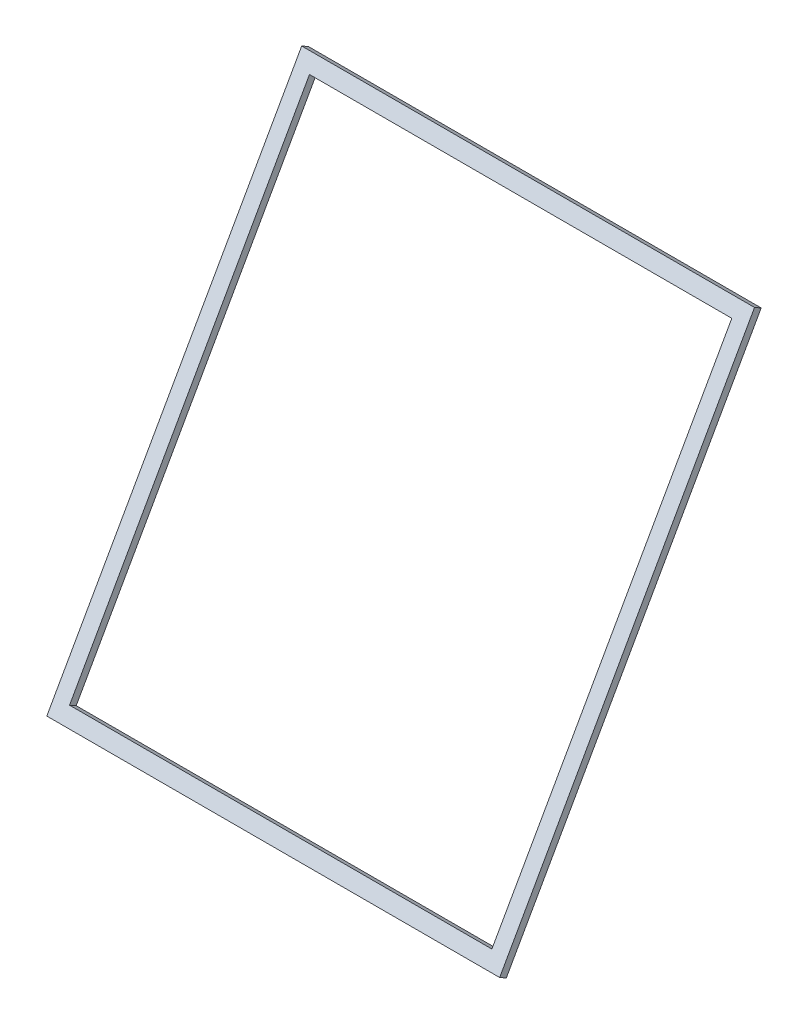
ISO-10303-21;
HEADER;
FILE_DESCRIPTION(('STEP AP214'),'2;1');
FILE_NAME('part.step','',(''),(''),'','','');
FILE_SCHEMA(('AUTOMOTIVE_DESIGN { 1 0 10303 214 1 1 1 1 }'));
ENDSEC;
DATA;
#1=APPLICATION_CONTEXT('core data for automotive mechanical design processes');
#2=APPLICATION_PROTOCOL_DEFINITION('international standard','automotive_design',2000,#1);
#3=PRODUCT_CONTEXT('',#1,'mechanical');
#4=PRODUCT('Part','Part','',(#3));
#5=PRODUCT_RELATED_PRODUCT_CATEGORY('part','',(#4));
#6=PRODUCT_DEFINITION_FORMATION('','',#4);
#7=PRODUCT_DEFINITION_CONTEXT('part definition',#1,'design');
#8=PRODUCT_DEFINITION('design','',#6,#7);
#9=PRODUCT_DEFINITION_SHAPE('','',#8);
#10=(LENGTH_UNIT() NAMED_UNIT(*) SI_UNIT(.MILLI.,.METRE.));
#11=(NAMED_UNIT(*) PLANE_ANGLE_UNIT() SI_UNIT($,.RADIAN.));
#12=(NAMED_UNIT(*) SI_UNIT($,.STERADIAN.) SOLID_ANGLE_UNIT());
#13=UNCERTAINTY_MEASURE_WITH_UNIT(LENGTH_MEASURE(1.E-05),#10,'distance_accuracy_value','');
#14=(GEOMETRIC_REPRESENTATION_CONTEXT(3) GLOBAL_UNCERTAINTY_ASSIGNED_CONTEXT((#13)) GLOBAL_UNIT_ASSIGNED_CONTEXT((#10,
#11,#12)) REPRESENTATION_CONTEXT('',''));
#15=CARTESIAN_POINT('',(0.,0.,0.));
#16=DIRECTION('',(0.,0.,1.));
#17=DIRECTION('',(1.,0.,0.));
#18=AXIS2_PLACEMENT_3D('',#15,#16,#17);
#19=CARTESIAN_POINT('',(-156.14773579459,170.242583244298,-2.17498509552936));
#20=DIRECTION('',(-1.,0.,0.));
#21=DIRECTION('',(0.,0.,1.));
#22=AXIS2_PLACEMENT_3D('',#19,#20,#21);
#23=PLANE('',#22);
#24=DIRECTION('',(0.,0.87144251679812,-0.490497645169228));
#25=VECTOR('',#24,1.);
#26=CARTESIAN_POINT('',(-156.14773579459,167.790095018452,-6.53219767951996));
#27=LINE('',#26,#25);
#28=CARTESIAN_POINT('',(-156.14773579459,-128.9971906038,160.516645942148));
#29=VERTEX_POINT('',#28);
#30=CARTESIAN_POINT('',(-156.14773579459,167.790095018452,-6.53219767951996));
#31=VERTEX_POINT('',#30);
#32=EDGE_CURVE('E131',#29,#31,#27,.T.);
#33=ORIENTED_EDGE('',*,*,#32,.F.);
#34=DIRECTION('',(0.,-0.490497645169228,-0.87144251679812));
#35=VECTOR('',#34,1.);
#36=CARTESIAN_POINT('',(-156.14773579459,-126.544702377954,164.873858526138));
#37=LINE('',#36,#35);
#38=CARTESIAN_POINT('',(-156.14773579459,-126.544702377954,164.873858526138));
#39=VERTEX_POINT('',#38);
#40=EDGE_CURVE('E11',#39,#29,#37,.T.);
#41=ORIENTED_EDGE('',*,*,#40,.F.);
#42=DIRECTION('',(0.,0.87144251679812,-0.490497645169228));
#43=VECTOR('',#42,1.);
#44=CARTESIAN_POINT('',(-156.14773579459,170.242583244298,-2.17498509552936));
#45=LINE('',#44,#43);
#46=CARTESIAN_POINT('',(-156.14773579459,170.242583244298,-2.17498509552936));
#47=VERTEX_POINT('',#46);
#48=EDGE_CURVE('E135',#39,#47,#45,.T.);
#49=ORIENTED_EDGE('',*,*,#48,.T.);
#50=DIRECTION('',(0.,-0.490497645169228,-0.87144251679812));
#51=VECTOR('',#50,1.);
#52=CARTESIAN_POINT('',(-156.14773579459,170.242583244298,-2.17498509552936));
#53=LINE('',#52,#51);
#54=EDGE_CURVE('E36',#47,#31,#53,.T.);
#55=ORIENTED_EDGE('',*,*,#54,.T.);
#56=EDGE_LOOP('',(#33,#41,#49,#55));
#57=FACE_BOUND('',#56,.T.);
#58=ADVANCED_FACE('F33',(#57),#23,.T.);
#59=CARTESIAN_POINT('',(140.639549827685,-126.544702377954,164.873858526138));
#60=DIRECTION('',(0.,-0.87144251679812,0.490497645169228));
#61=DIRECTION('',(0.,-0.490497645169228,-0.87144251679812));
#62=AXIS2_PLACEMENT_3D('',#59,#60,#61);
#63=PLANE('',#62);
#64=DIRECTION('',(-1.,0.,0.));
#65=VECTOR('',#64,1.);
#66=CARTESIAN_POINT('',(140.639549827685,-128.9971906038,160.516645942148));
#67=LINE('',#66,#65);
#68=CARTESIAN_POINT('',(140.639549827685,-128.9971906038,160.516645942148));
#69=VERTEX_POINT('',#68);
#70=EDGE_CURVE('E139',#69,#29,#67,.T.);
#71=ORIENTED_EDGE('',*,*,#70,.F.);
#72=DIRECTION('',(0.,-0.490497645169228,-0.87144251679812));
#73=VECTOR('',#72,1.);
#74=CARTESIAN_POINT('',(140.639549827685,-126.544702377954,164.873858526138));
#75=LINE('',#74,#73);
#76=CARTESIAN_POINT('',(140.639549827685,-126.544702377954,164.873858526138));
#77=VERTEX_POINT('',#76);
#78=EDGE_CURVE('E41',#77,#69,#75,.T.);
#79=ORIENTED_EDGE('',*,*,#78,.F.);
#80=DIRECTION('',(-1.,0.,0.));
#81=VECTOR('',#80,1.);
#82=CARTESIAN_POINT('',(140.639549827685,-126.544702377954,164.873858526138));
#83=LINE('',#82,#81);
#84=EDGE_CURVE('E145',#77,#39,#83,.T.);
#85=ORIENTED_EDGE('',*,*,#84,.T.);
#86=ORIENTED_EDGE('',*,*,#40,.T.);
#87=EDGE_LOOP('',(#71,#79,#85,#86));
#88=FACE_BOUND('',#87,.T.);
#89=ADVANCED_FACE('F171',(#88),#63,.T.);
#90=CARTESIAN_POINT('',(140.639549827685,170.242583244298,-2.17498509552936));
#91=DIRECTION('',(1.,0.,0.));
#92=DIRECTION('',(0.,0.,-1.));
#93=AXIS2_PLACEMENT_3D('',#90,#91,#92);
#94=PLANE('',#93);
#95=DIRECTION('',(0.,-0.87144251679812,0.490497645169228));
#96=VECTOR('',#95,1.);
#97=CARTESIAN_POINT('',(140.639549827685,167.790095018452,-6.53219767951996));
#98=LINE('',#97,#96);
#99=CARTESIAN_POINT('',(140.639549827685,167.790095018452,-6.53219767951996));
#100=VERTEX_POINT('',#99);
#101=EDGE_CURVE('E153',#100,#69,#98,.T.);
#102=ORIENTED_EDGE('',*,*,#101,.F.);
#103=DIRECTION('',(0.,-0.490497645169228,-0.87144251679812));
#104=VECTOR('',#103,1.);
#105=CARTESIAN_POINT('',(140.639549827685,170.242583244298,-2.17498509552936));
#106=LINE('',#105,#104);
#107=CARTESIAN_POINT('',(140.639549827685,170.242583244298,-2.17498509552936));
#108=VERTEX_POINT('',#107);
#109=EDGE_CURVE('E158',#108,#100,#106,.T.);
#110=ORIENTED_EDGE('',*,*,#109,.F.);
#111=DIRECTION('',(0.,-0.87144251679812,0.490497645169228));
#112=VECTOR('',#111,1.);
#113=CARTESIAN_POINT('',(140.639549827685,170.242583244298,-2.17498509552936));
#114=LINE('',#113,#112);
#115=EDGE_CURVE('E142',#108,#77,#114,.T.);
#116=ORIENTED_EDGE('',*,*,#115,.T.);
#117=ORIENTED_EDGE('',*,*,#78,.T.);
#118=EDGE_LOOP('',(#102,#110,#116,#117));
#119=FACE_BOUND('',#118,.T.);
#120=ADVANCED_FACE('F175',(#119),#94,.T.);
#121=CARTESIAN_POINT('',(140.639549827685,170.242583244298,-2.17498509552936));
#122=DIRECTION('',(0.,0.87144251679812,-0.490497645169228));
#123=DIRECTION('',(0.,0.490497645169228,0.87144251679812));
#124=AXIS2_PLACEMENT_3D('',#121,#122,#123);
#125=PLANE('',#124);
#126=DIRECTION('',(1.,0.,0.));
#127=VECTOR('',#126,1.);
#128=CARTESIAN_POINT('',(140.639549827685,167.790095018452,-6.53219767951996));
#129=LINE('',#128,#127);
#130=EDGE_CURVE('E150',#31,#100,#129,.T.);
#131=ORIENTED_EDGE('',*,*,#130,.F.);
#132=ORIENTED_EDGE('',*,*,#54,.F.);
#133=DIRECTION('',(1.,0.,0.));
#134=VECTOR('',#133,1.);
#135=CARTESIAN_POINT('',(140.639549827685,170.242583244298,-2.17498509552936));
#136=LINE('',#135,#134);
#137=EDGE_CURVE('E138',#47,#108,#136,.T.);
#138=ORIENTED_EDGE('',*,*,#137,.T.);
#139=ORIENTED_EDGE('',*,*,#109,.T.);
#140=EDGE_LOOP('',(#131,#132,#138,#139));
#141=FACE_BOUND('',#140,.T.);
#142=ADVANCED_FACE('F166',(#141),#125,.T.);
#143=CARTESIAN_POINT('',(0.,40.0286356668952,71.1168653980372));
#144=DIRECTION('',(0.,-0.490497645169228,-0.87144251679812));
#145=DIRECTION('',(0.,0.87144251679812,-0.490497645169228));
#146=AXIS2_PLACEMENT_3D('',#143,#144,#145);
#147=PLANE('',#146);
#148=DIRECTION('',(1.,0.,0.));
#149=VECTOR('',#148,1.);
#150=CARTESIAN_POINT('',(130.639549827685,161.528158076316,2.72999135616292));
#151=LINE('',#150,#149);
#152=CARTESIAN_POINT('',(-146.14773579459,161.528158076316,2.72999135616292));
#153=VERTEX_POINT('',#152);
#154=CARTESIAN_POINT('',(130.639549827685,161.528158076316,2.72999135616292));
#155=VERTEX_POINT('',#154);
#156=EDGE_CURVE('E106',#153,#155,#151,.T.);
#157=ORIENTED_EDGE('',*,*,#156,.T.);
#158=DIRECTION('',(0.,-0.87144251679812,0.490497645169228));
#159=VECTOR('',#158,1.);
#160=CARTESIAN_POINT('',(130.639549827685,161.528158076316,2.72999135616292));
#161=LINE('',#160,#159);
#162=CARTESIAN_POINT('',(130.639549827685,-117.830277209973,159.968882074446));
#163=VERTEX_POINT('',#162);
#164=EDGE_CURVE('E100',#155,#163,#161,.T.);
#165=ORIENTED_EDGE('',*,*,#164,.T.);
#166=DIRECTION('',(-1.,0.,0.));
#167=VECTOR('',#166,1.);
#168=CARTESIAN_POINT('',(130.639549827685,-117.830277209973,159.968882074446));
#169=LINE('',#168,#167);
#170=CARTESIAN_POINT('',(-146.14773579459,-117.830277209973,159.968882074446));
#171=VERTEX_POINT('',#170);
#172=EDGE_CURVE('E109',#163,#171,#169,.T.);
#173=ORIENTED_EDGE('',*,*,#172,.T.);
#174=DIRECTION('',(0.,0.87144251679812,-0.490497645169228));
#175=VECTOR('',#174,1.);
#176=CARTESIAN_POINT('',(-146.14773579459,161.528158076316,2.72999135616292));
#177=LINE('',#176,#175);
#178=EDGE_CURVE('E49',#171,#153,#177,.T.);
#179=ORIENTED_EDGE('',*,*,#178,.T.);
#180=EDGE_LOOP('',(#157,#165,#173,#179));
#181=FACE_BOUND('',#180,.T.);
#182=ORIENTED_EDGE('',*,*,#48,.F.);
#183=ORIENTED_EDGE('',*,*,#84,.F.);
#184=ORIENTED_EDGE('',*,*,#115,.F.);
#185=ORIENTED_EDGE('',*,*,#137,.F.);
#186=EDGE_LOOP('',(#182,#183,#184,#185));
#187=FACE_BOUND('',#186,.T.);
#188=ADVANCED_FACE('F113',(#181,#187),#147,.F.);
#189=CARTESIAN_POINT('',(0.,37.5761474410491,66.7596528140466));
#190=DIRECTION('',(0.,-0.490497645169228,-0.87144251679812));
#191=DIRECTION('',(0.,0.87144251679812,-0.490497645169228));
#192=AXIS2_PLACEMENT_3D('',#189,#190,#191);
#193=PLANE('',#192);
#194=DIRECTION('',(0.,-0.87144251679812,0.490497645169228));
#195=VECTOR('',#194,1.);
#196=CARTESIAN_POINT('',(130.639549827685,159.07566985047,-1.62722122782769));
#197=LINE('',#196,#195);
#198=CARTESIAN_POINT('',(130.639549827685,159.07566985047,-1.62722122782769));
#199=VERTEX_POINT('',#198);
#200=CARTESIAN_POINT('',(130.639549827685,-120.282765435819,155.611669490455));
#201=VERTEX_POINT('',#200);
#202=EDGE_CURVE('E57',#199,#201,#197,.T.);
#203=ORIENTED_EDGE('',*,*,#202,.F.);
#204=DIRECTION('',(1.,0.,0.));
#205=VECTOR('',#204,1.);
#206=CARTESIAN_POINT('',(130.639549827685,159.07566985047,-1.62722122782769));
#207=LINE('',#206,#205);
#208=CARTESIAN_POINT('',(-146.14773579459,159.07566985047,-1.62722122782769));
#209=VERTEX_POINT('',#208);
#210=EDGE_CURVE('E116',#209,#199,#207,.T.);
#211=ORIENTED_EDGE('',*,*,#210,.F.);
#212=DIRECTION('',(0.,0.87144251679812,-0.490497645169228));
#213=VECTOR('',#212,1.);
#214=CARTESIAN_POINT('',(-146.14773579459,159.07566985047,-1.62722122782769));
#215=LINE('',#214,#213);
#216=CARTESIAN_POINT('',(-146.14773579459,-120.282765435819,155.611669490455));
#217=VERTEX_POINT('',#216);
#218=EDGE_CURVE('E119',#217,#209,#215,.T.);
#219=ORIENTED_EDGE('',*,*,#218,.F.);
#220=DIRECTION('',(-1.,0.,0.));
#221=VECTOR('',#220,1.);
#222=CARTESIAN_POINT('',(130.639549827685,-120.282765435819,155.611669490455));
#223=LINE('',#222,#221);
#224=EDGE_CURVE('E125',#201,#217,#223,.T.);
#225=ORIENTED_EDGE('',*,*,#224,.F.);
#226=EDGE_LOOP('',(#203,#211,#219,#225));
#227=FACE_BOUND('',#226,.T.);
#228=ORIENTED_EDGE('',*,*,#32,.T.);
#229=ORIENTED_EDGE('',*,*,#130,.T.);
#230=ORIENTED_EDGE('',*,*,#101,.T.);
#231=ORIENTED_EDGE('',*,*,#70,.T.);
#232=EDGE_LOOP('',(#228,#229,#230,#231));
#233=FACE_BOUND('',#232,.T.);
#234=ADVANCED_FACE('F168',(#227,#233),#193,.T.);
#235=CARTESIAN_POINT('',(130.639549827685,161.528158076316,2.72999135616292));
#236=DIRECTION('',(1.,0.,0.));
#237=DIRECTION('',(0.,0.,-1.));
#238=AXIS2_PLACEMENT_3D('',#235,#236,#237);
#239=PLANE('',#238);
#240=ORIENTED_EDGE('',*,*,#202,.T.);
#241=DIRECTION('',(0.,-0.490497645169228,-0.87144251679812));
#242=VECTOR('',#241,1.);
#243=CARTESIAN_POINT('',(130.639549827685,-117.830277209973,159.968882074446));
#244=LINE('',#243,#242);
#245=EDGE_CURVE('E96',#163,#201,#244,.T.);
#246=ORIENTED_EDGE('',*,*,#245,.F.);
#247=ORIENTED_EDGE('',*,*,#164,.F.);
#248=DIRECTION('',(0.,-0.490497645169228,-0.87144251679812));
#249=VECTOR('',#248,1.);
#250=CARTESIAN_POINT('',(130.639549827685,161.528158076316,2.72999135616292));
#251=LINE('',#250,#249);
#252=EDGE_CURVE('E129',#155,#199,#251,.T.);
#253=ORIENTED_EDGE('',*,*,#252,.T.);
#254=EDGE_LOOP('',(#240,#246,#247,#253));
#255=FACE_BOUND('',#254,.T.);
#256=ADVANCED_FACE('F98',(#255),#239,.F.);
#257=CARTESIAN_POINT('',(130.639549827685,161.528158076316,2.72999135616292));
#258=DIRECTION('',(0.,0.87144251679812,-0.490497645169228));
#259=DIRECTION('',(0.,0.490497645169228,0.87144251679812));
#260=AXIS2_PLACEMENT_3D('',#257,#258,#259);
#261=PLANE('',#260);
#262=ORIENTED_EDGE('',*,*,#210,.T.);
#263=ORIENTED_EDGE('',*,*,#252,.F.);
#264=ORIENTED_EDGE('',*,*,#156,.F.);
#265=DIRECTION('',(0.,-0.490497645169228,-0.87144251679812));
#266=VECTOR('',#265,1.);
#267=CARTESIAN_POINT('',(-146.14773579459,161.528158076316,2.72999135616292));
#268=LINE('',#267,#266);
#269=EDGE_CURVE('E132',#153,#209,#268,.T.);
#270=ORIENTED_EDGE('',*,*,#269,.T.);
#271=EDGE_LOOP('',(#262,#263,#264,#270));
#272=FACE_BOUND('',#271,.T.);
#273=ADVANCED_FACE('F226',(#272),#261,.F.);
#274=CARTESIAN_POINT('',(-146.14773579459,161.528158076316,2.72999135616292));
#275=DIRECTION('',(-1.,0.,0.));
#276=DIRECTION('',(0.,0.,1.));
#277=AXIS2_PLACEMENT_3D('',#274,#275,#276);
#278=PLANE('',#277);
#279=ORIENTED_EDGE('',*,*,#218,.T.);
#280=ORIENTED_EDGE('',*,*,#269,.F.);
#281=ORIENTED_EDGE('',*,*,#178,.F.);
#282=DIRECTION('',(0.,-0.490497645169228,-0.87144251679812));
#283=VECTOR('',#282,1.);
#284=CARTESIAN_POINT('',(-146.14773579459,-117.830277209973,159.968882074446));
#285=LINE('',#284,#283);
#286=EDGE_CURVE('E105',#171,#217,#285,.T.);
#287=ORIENTED_EDGE('',*,*,#286,.T.);
#288=EDGE_LOOP('',(#279,#280,#281,#287));
#289=FACE_BOUND('',#288,.T.);
#290=ADVANCED_FACE('F235',(#289),#278,.F.);
#291=CARTESIAN_POINT('',(130.639549827685,-117.830277209973,159.968882074446));
#292=DIRECTION('',(0.,-0.87144251679812,0.490497645169228));
#293=DIRECTION('',(0.,-0.490497645169228,-0.87144251679812));
#294=AXIS2_PLACEMENT_3D('',#291,#292,#293);
#295=PLANE('',#294);
#296=ORIENTED_EDGE('',*,*,#224,.T.);
#297=ORIENTED_EDGE('',*,*,#286,.F.);
#298=ORIENTED_EDGE('',*,*,#172,.F.);
#299=ORIENTED_EDGE('',*,*,#245,.T.);
#300=EDGE_LOOP('',(#296,#297,#298,#299));
#301=FACE_BOUND('',#300,.T.);
#302=ADVANCED_FACE('F110',(#301),#295,.F.);
#303=CLOSED_SHELL('',(#58,#89,#120,#142,#188,#234,#256,#273,#290,#302));
#304=MANIFOLD_SOLID_BREP('B2',#303);
#305=ADVANCED_BREP_SHAPE_REPRESENTATION('',(#18,#304),#14);
#306=SHAPE_DEFINITION_REPRESENTATION(#9,#305);
ENDSEC;
END-ISO-10303-21;
